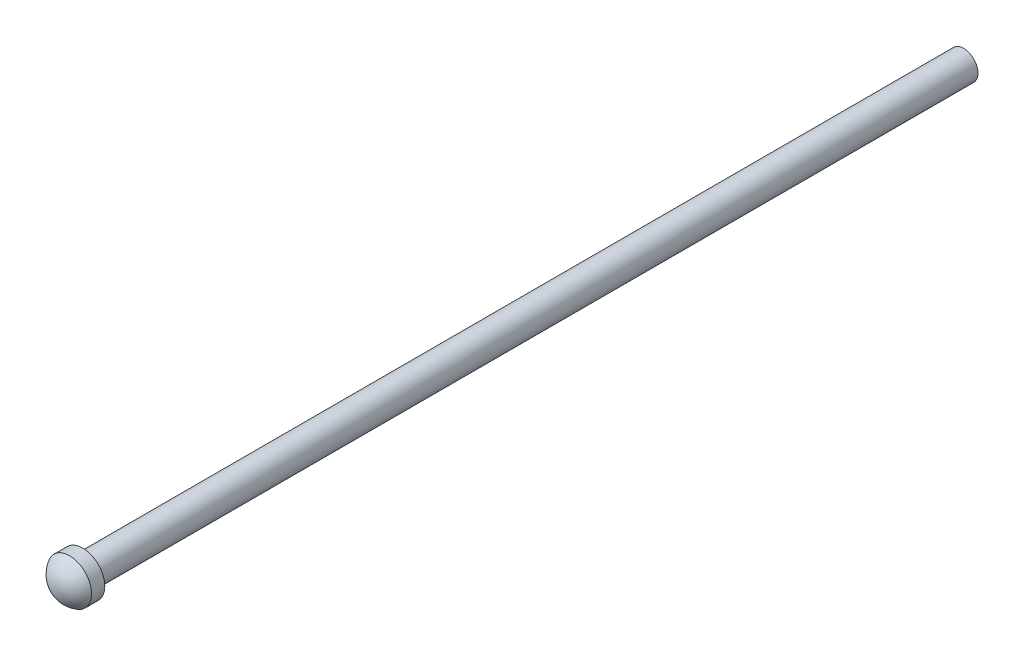
ISO-10303-21;
HEADER;
FILE_DESCRIPTION(('STEP AP214'),'2;1');
FILE_NAME('part.step','',(''),(''),'','','');
FILE_SCHEMA(('AUTOMOTIVE_DESIGN { 1 0 10303 214 1 1 1 1 }'));
ENDSEC;
DATA;
#1=APPLICATION_CONTEXT('core data for automotive mechanical design processes');
#2=APPLICATION_PROTOCOL_DEFINITION('international standard','automotive_design',2000,#1);
#3=PRODUCT_CONTEXT('',#1,'mechanical');
#4=PRODUCT('Part','Part','',(#3));
#5=PRODUCT_RELATED_PRODUCT_CATEGORY('part','',(#4));
#6=PRODUCT_DEFINITION_FORMATION('','',#4);
#7=PRODUCT_DEFINITION_CONTEXT('part definition',#1,'design');
#8=PRODUCT_DEFINITION('design','',#6,#7);
#9=PRODUCT_DEFINITION_SHAPE('','',#8);
#10=(LENGTH_UNIT() NAMED_UNIT(*) SI_UNIT(.MILLI.,.METRE.));
#11=(NAMED_UNIT(*) PLANE_ANGLE_UNIT() SI_UNIT($,.RADIAN.));
#12=(NAMED_UNIT(*) SI_UNIT($,.STERADIAN.) SOLID_ANGLE_UNIT());
#13=UNCERTAINTY_MEASURE_WITH_UNIT(LENGTH_MEASURE(1.E-05),#10,'distance_accuracy_value','');
#14=(GEOMETRIC_REPRESENTATION_CONTEXT(3) GLOBAL_UNCERTAINTY_ASSIGNED_CONTEXT((#13)) GLOBAL_UNIT_ASSIGNED_CONTEXT((#10,
#11,#12)) REPRESENTATION_CONTEXT('',''));
#15=CARTESIAN_POINT('',(0.,0.,0.));
#16=DIRECTION('',(0.,0.,1.));
#17=DIRECTION('',(1.,0.,0.));
#18=AXIS2_PLACEMENT_3D('',#15,#16,#17);
#19=CARTESIAN_POINT('',(5.,60.,-200.));
#20=DIRECTION('',(0.,0.,1.));
#21=DIRECTION('',(1.,0.,0.));
#22=AXIS2_PLACEMENT_3D('',#19,#20,#21);
#23=PLANE('',#22);
#24=CARTESIAN_POINT('',(5.,60.,-200.));
#25=DIRECTION('',(0.,0.,1.));
#26=DIRECTION('',(1.,0.,0.));
#27=AXIS2_PLACEMENT_3D('',#24,#25,#26);
#28=CIRCLE('',#27,3.25);
#29=CARTESIAN_POINT('',(8.25,60.,-200.));
#30=VERTEX_POINT('',#29);
#31=EDGE_CURVE('E10',#30,#30,#28,.T.);
#32=ORIENTED_EDGE('',*,*,#31,.F.);
#33=EDGE_LOOP('',(#32));
#34=FACE_BOUND('',#33,.T.);
#35=ADVANCED_FACE('F31',(#34),#23,.F.);
#36=CARTESIAN_POINT('',(5.,60.,0.));
#37=DIRECTION('',(0.,0.,-1.));
#38=DIRECTION('',(-1.,0.,0.));
#39=AXIS2_PLACEMENT_3D('',#36,#37,#38);
#40=CYLINDRICAL_SURFACE('',#39,3.25);
#41=ORIENTED_EDGE('',*,*,#31,.T.);
#42=EDGE_LOOP('',(#41));
#43=FACE_BOUND('',#42,.T.);
#44=CARTESIAN_POINT('',(5.,60.,0.));
#45=DIRECTION('',(0.,0.,1.));
#46=DIRECTION('',(1.,0.,0.));
#47=AXIS2_PLACEMENT_3D('',#44,#45,#46);
#48=CIRCLE('',#47,3.25);
#49=CARTESIAN_POINT('',(8.25,60.,0.));
#50=VERTEX_POINT('',#49);
#51=EDGE_CURVE('E39',#50,#50,#48,.T.);
#52=ORIENTED_EDGE('',*,*,#51,.F.);
#53=EDGE_LOOP('',(#52));
#54=FACE_BOUND('',#53,.T.);
#55=ADVANCED_FACE('F55',(#43,#54),#40,.T.);
#56=CARTESIAN_POINT('',(5.,60.,3.));
#57=DIRECTION('',(0.,0.,-1.));
#58=DIRECTION('',(-1.,0.,0.));
#59=AXIS2_PLACEMENT_3D('',#56,#57,#58);
#60=CYLINDRICAL_SURFACE('',#59,5.);
#61=CARTESIAN_POINT('',(5.,60.,3.));
#62=DIRECTION('',(0.,0.,1.));
#63=DIRECTION('',(1.,0.,0.));
#64=AXIS2_PLACEMENT_3D('',#61,#62,#63);
#65=CIRCLE('',#64,5.);
#66=CARTESIAN_POINT('',(10.,60.,3.));
#67=VERTEX_POINT('',#66);
#68=EDGE_CURVE('E35',#67,#67,#65,.T.);
#69=ORIENTED_EDGE('',*,*,#68,.F.);
#70=EDGE_LOOP('',(#69));
#71=FACE_BOUND('',#70,.T.);
#72=CARTESIAN_POINT('',(5.,60.,0.));
#73=DIRECTION('',(0.,0.,1.));
#74=DIRECTION('',(1.,0.,0.));
#75=AXIS2_PLACEMENT_3D('',#72,#73,#74);
#76=CIRCLE('',#75,5.);
#77=CARTESIAN_POINT('',(10.,60.,0.));
#78=VERTEX_POINT('',#77);
#79=EDGE_CURVE('E45',#78,#78,#76,.T.);
#80=ORIENTED_EDGE('',*,*,#79,.T.);
#81=EDGE_LOOP('',(#80));
#82=FACE_BOUND('',#81,.T.);
#83=ADVANCED_FACE('F53',(#71,#82),#60,.T.);
#84=CARTESIAN_POINT('',(5.,60.,0.333333333333338));
#85=DIRECTION('',(0.,0.,1.));
#86=DIRECTION('',(1.,0.,0.));
#87=AXIS2_PLACEMENT_3D('',#84,#85,#86);
#88=SPHERICAL_SURFACE('',#87,5.66666666666666);
#89=ORIENTED_EDGE('',*,*,#68,.T.);
#90=EDGE_LOOP('',(#89));
#91=FACE_BOUND('',#90,.T.);
#92=ADVANCED_FACE('F33',(#91),#88,.T.);
#93=CARTESIAN_POINT('',(5.,60.,0.));
#94=DIRECTION('',(0.,0.,1.));
#95=DIRECTION('',(1.,0.,0.));
#96=AXIS2_PLACEMENT_3D('',#93,#94,#95);
#97=PLANE('',#96);
#98=ORIENTED_EDGE('',*,*,#51,.T.);
#99=EDGE_LOOP('',(#98));
#100=FACE_BOUND('',#99,.T.);
#101=ORIENTED_EDGE('',*,*,#79,.F.);
#102=EDGE_LOOP('',(#101));
#103=FACE_BOUND('',#102,.T.);
#104=ADVANCED_FACE('F61',(#100,#103),#97,.F.);
#105=CLOSED_SHELL('',(#35,#55,#83,#92,#104));
#106=MANIFOLD_SOLID_BREP('B2',#105);
#107=ADVANCED_BREP_SHAPE_REPRESENTATION('',(#18,#106),#14);
#108=SHAPE_DEFINITION_REPRESENTATION(#9,#107);
ENDSEC;
END-ISO-10303-21;
